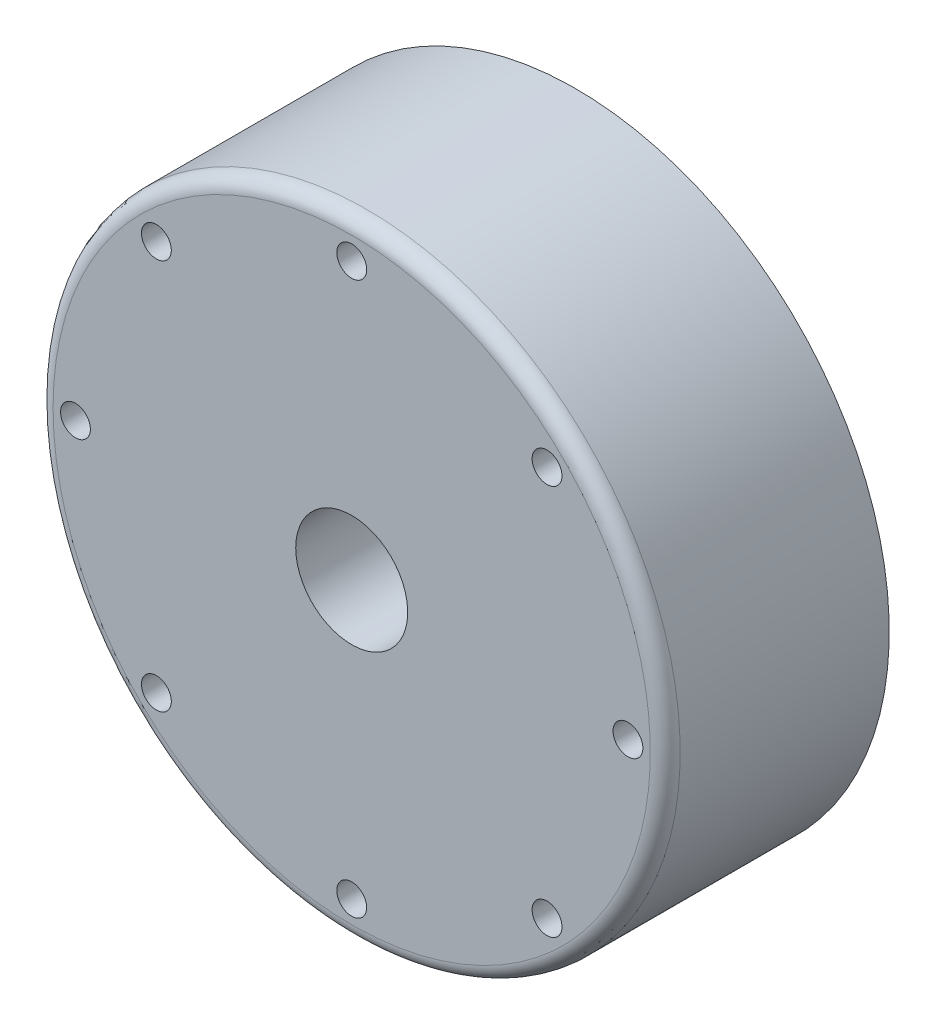
ISO-10303-21;
HEADER;
FILE_DESCRIPTION(('STEP AP214'),'2;1');
FILE_NAME('part.step','',(''),(''),'','','');
FILE_SCHEMA(('AUTOMOTIVE_DESIGN { 1 0 10303 214 1 1 1 1 }'));
ENDSEC;
DATA;
#1=APPLICATION_CONTEXT('core data for automotive mechanical design processes');
#2=APPLICATION_PROTOCOL_DEFINITION('international standard','automotive_design',2000,#1);
#3=PRODUCT_CONTEXT('',#1,'mechanical');
#4=PRODUCT('Part','Part','',(#3));
#5=PRODUCT_RELATED_PRODUCT_CATEGORY('part','',(#4));
#6=PRODUCT_DEFINITION_FORMATION('','',#4);
#7=PRODUCT_DEFINITION_CONTEXT('part definition',#1,'design');
#8=PRODUCT_DEFINITION('design','',#6,#7);
#9=PRODUCT_DEFINITION_SHAPE('','',#8);
#10=(LENGTH_UNIT() NAMED_UNIT(*) SI_UNIT(.MILLI.,.METRE.));
#11=(NAMED_UNIT(*) PLANE_ANGLE_UNIT() SI_UNIT($,.RADIAN.));
#12=(NAMED_UNIT(*) SI_UNIT($,.STERADIAN.) SOLID_ANGLE_UNIT());
#13=UNCERTAINTY_MEASURE_WITH_UNIT(LENGTH_MEASURE(1.E-05),#10,'distance_accuracy_value','');
#14=(GEOMETRIC_REPRESENTATION_CONTEXT(3) GLOBAL_UNCERTAINTY_ASSIGNED_CONTEXT((#13)) GLOBAL_UNIT_ASSIGNED_CONTEXT((#10,
#11,#12)) REPRESENTATION_CONTEXT('',''));
#15=CARTESIAN_POINT('',(0.,0.,0.));
#16=DIRECTION('',(0.,0.,1.));
#17=DIRECTION('',(1.,0.,0.));
#18=AXIS2_PLACEMENT_3D('',#15,#16,#17);
#19=CARTESIAN_POINT('',(0.,0.,0.));
#20=DIRECTION('',(0.,0.,1.));
#21=DIRECTION('',(1.,0.,0.));
#22=AXIS2_PLACEMENT_3D('',#19,#20,#21);
#23=PLANE('',#22);
#24=CARTESIAN_POINT('',(0.,0.,0.));
#25=DIRECTION('',(0.,0.,1.));
#26=DIRECTION('',(1.,0.,0.));
#27=AXIS2_PLACEMENT_3D('',#24,#25,#26);
#28=CIRCLE('',#27,7.5);
#29=CARTESIAN_POINT('',(-7.5,0.,0.));
#30=VERTEX_POINT('',#29);
#31=EDGE_CURVE('E93',#30,#30,#28,.T.);
#32=ORIENTED_EDGE('',*,*,#31,.T.);
#33=EDGE_LOOP('',(#32));
#34=FACE_BOUND('',#33,.T.);
#35=CARTESIAN_POINT('',(0.,0.,0.));
#36=DIRECTION('',(0.,0.,1.));
#37=DIRECTION('',(1.,0.,0.));
#38=AXIS2_PLACEMENT_3D('',#35,#36,#37);
#39=CIRCLE('',#38,42.);
#40=CARTESIAN_POINT('',(-42.,0.,0.));
#41=VERTEX_POINT('',#40);
#42=EDGE_CURVE('E11',#41,#41,#39,.T.);
#43=ORIENTED_EDGE('',*,*,#42,.F.);
#44=EDGE_LOOP('',(#43));
#45=FACE_BOUND('',#44,.T.);
#46=ADVANCED_FACE('F17',(#34,#45),#23,.F.);
#47=CARTESIAN_POINT('',(0.,0.,30.));
#48=DIRECTION('',(0.,0.,1.));
#49=DIRECTION('',(1.,0.,0.));
#50=AXIS2_PLACEMENT_3D('',#47,#48,#49);
#51=PLANE('',#50);
#52=CARTESIAN_POINT('',(0.,0.,30.));
#53=DIRECTION('',(0.,0.,-1.));
#54=DIRECTION('',(1.,0.,0.));
#55=AXIS2_PLACEMENT_3D('',#52,#53,#54);
#56=CIRCLE('',#55,7.5);
#57=CARTESIAN_POINT('',(-7.5,0.,30.));
#58=VERTEX_POINT('',#57);
#59=EDGE_CURVE('E123',#58,#58,#56,.T.);
#60=ORIENTED_EDGE('',*,*,#59,.T.);
#61=EDGE_LOOP('',(#60));
#62=FACE_BOUND('',#61,.T.);
#63=CARTESIAN_POINT('',(0.,37.,30.));
#64=DIRECTION('',(0.,0.,-1.));
#65=DIRECTION('',(1.,0.,0.));
#66=AXIS2_PLACEMENT_3D('',#63,#64,#65);
#67=CIRCLE('',#66,2.);
#68=CARTESIAN_POINT('',(-2.,37.,30.));
#69=VERTEX_POINT('',#68);
#70=EDGE_CURVE('E191',#69,#69,#67,.T.);
#71=ORIENTED_EDGE('',*,*,#70,.T.);
#72=EDGE_LOOP('',(#71));
#73=FACE_BOUND('',#72,.T.);
#74=CARTESIAN_POINT('',(0.,-37.,30.));
#75=DIRECTION('',(0.,0.,-1.));
#76=DIRECTION('',(1.,0.,0.));
#77=AXIS2_PLACEMENT_3D('',#74,#75,#76);
#78=CIRCLE('',#77,2.);
#79=CARTESIAN_POINT('',(-2.,-37.,30.));
#80=VERTEX_POINT('',#79);
#81=EDGE_CURVE('E117',#80,#80,#78,.T.);
#82=ORIENTED_EDGE('',*,*,#81,.T.);
#83=EDGE_LOOP('',(#82));
#84=FACE_BOUND('',#83,.T.);
#85=CARTESIAN_POINT('',(-26.1629509039023,26.1629509039023,30.));
#86=DIRECTION('',(0.,0.,-1.));
#87=DIRECTION('',(1.,0.,0.));
#88=AXIS2_PLACEMENT_3D('',#85,#86,#87);
#89=CIRCLE('',#88,2.);
#90=CARTESIAN_POINT('',(-28.1629509039023,26.1629509039023,30.));
#91=VERTEX_POINT('',#90);
#92=EDGE_CURVE('E171',#91,#91,#89,.T.);
#93=ORIENTED_EDGE('',*,*,#92,.T.);
#94=EDGE_LOOP('',(#93));
#95=FACE_BOUND('',#94,.T.);
#96=CARTESIAN_POINT('',(26.1629509039023,-26.1629509039023,30.));
#97=DIRECTION('',(0.,0.,-1.));
#98=DIRECTION('',(1.,0.,0.));
#99=AXIS2_PLACEMENT_3D('',#96,#97,#98);
#100=CIRCLE('',#99,2.);
#101=CARTESIAN_POINT('',(24.1629509039023,-26.1629509039023,30.));
#102=VERTEX_POINT('',#101);
#103=EDGE_CURVE('E125',#102,#102,#100,.T.);
#104=ORIENTED_EDGE('',*,*,#103,.T.);
#105=EDGE_LOOP('',(#104));
#106=FACE_BOUND('',#105,.T.);
#107=CARTESIAN_POINT('',(26.1629509039023,26.1629509039022,30.));
#108=DIRECTION('',(0.,0.,-1.));
#109=DIRECTION('',(1.,0.,0.));
#110=AXIS2_PLACEMENT_3D('',#107,#108,#109);
#111=CIRCLE('',#110,2.);
#112=CARTESIAN_POINT('',(24.1629509039023,26.1629509039022,30.));
#113=VERTEX_POINT('',#112);
#114=EDGE_CURVE('E190',#113,#113,#111,.T.);
#115=ORIENTED_EDGE('',*,*,#114,.T.);
#116=EDGE_LOOP('',(#115));
#117=FACE_BOUND('',#116,.T.);
#118=CARTESIAN_POINT('',(-26.1629509039023,-26.1629509039023,30.));
#119=DIRECTION('',(0.,0.,-1.));
#120=DIRECTION('',(1.,0.,0.));
#121=AXIS2_PLACEMENT_3D('',#118,#119,#120);
#122=CIRCLE('',#121,2.);
#123=CARTESIAN_POINT('',(-28.1629509039023,-26.1629509039023,30.));
#124=VERTEX_POINT('',#123);
#125=EDGE_CURVE('E165',#124,#124,#122,.T.);
#126=ORIENTED_EDGE('',*,*,#125,.T.);
#127=EDGE_LOOP('',(#126));
#128=FACE_BOUND('',#127,.T.);
#129=CARTESIAN_POINT('',(-37.,0.,30.));
#130=DIRECTION('',(0.,0.,-1.));
#131=DIRECTION('',(1.,0.,0.));
#132=AXIS2_PLACEMENT_3D('',#129,#130,#131);
#133=CIRCLE('',#132,2.);
#134=CARTESIAN_POINT('',(-39.,0.,30.));
#135=VERTEX_POINT('',#134);
#136=EDGE_CURVE('E131',#135,#135,#133,.T.);
#137=ORIENTED_EDGE('',*,*,#136,.T.);
#138=EDGE_LOOP('',(#137));
#139=FACE_BOUND('',#138,.T.);
#140=CARTESIAN_POINT('',(37.,0.,30.));
#141=DIRECTION('',(0.,0.,-1.));
#142=DIRECTION('',(1.,0.,0.));
#143=AXIS2_PLACEMENT_3D('',#140,#141,#142);
#144=CIRCLE('',#143,2.);
#145=CARTESIAN_POINT('',(35.,0.,30.));
#146=VERTEX_POINT('',#145);
#147=EDGE_CURVE('E161',#146,#146,#144,.T.);
#148=ORIENTED_EDGE('',*,*,#147,.T.);
#149=EDGE_LOOP('',(#148));
#150=FACE_BOUND('',#149,.T.);
#151=CARTESIAN_POINT('',(0.,0.,30.));
#152=DIRECTION('',(0.,0.,-1.));
#153=DIRECTION('',(-1.,0.,0.));
#154=AXIS2_PLACEMENT_3D('',#151,#152,#153);
#155=CIRCLE('',#154,40.);
#156=CARTESIAN_POINT('',(-40.,0.,30.));
#157=VERTEX_POINT('',#156);
#158=EDGE_CURVE('E104',#157,#157,#155,.T.);
#159=ORIENTED_EDGE('',*,*,#158,.F.);
#160=EDGE_LOOP('',(#159));
#161=FACE_BOUND('',#160,.T.);
#162=ADVANCED_FACE('F243',(#62,#73,#84,#95,#106,#117,#128,#139,#150,#161),#51,.T.);
#163=CARTESIAN_POINT('',(0.,0.,0.));
#164=DIRECTION('',(0.,0.,1.));
#165=DIRECTION('',(1.,0.,0.));
#166=AXIS2_PLACEMENT_3D('',#163,#164,#165);
#167=CYLINDRICAL_SURFACE('',#166,42.);
#168=CARTESIAN_POINT('',(0.,0.,28.));
#169=DIRECTION('',(0.,0.,1.));
#170=DIRECTION('',(-1.,0.,0.));
#171=AXIS2_PLACEMENT_3D('',#168,#169,#170);
#172=CIRCLE('',#171,42.);
#173=CARTESIAN_POINT('',(-42.,0.,28.));
#174=VERTEX_POINT('',#173);
#175=EDGE_CURVE('E106',#174,#174,#172,.T.);
#176=ORIENTED_EDGE('',*,*,#175,.F.);
#177=DIRECTION('',(0.,0.,-1.));
#178=VECTOR('',#177,1.);
#179=CARTESIAN_POINT('',(-42.,0.,0.));
#180=LINE('',#179,#178);
#181=EDGE_CURVE('E28',#174,#41,#180,.T.);
#182=ORIENTED_EDGE('',*,*,#181,.T.);
#183=ORIENTED_EDGE('',*,*,#42,.T.);
#184=ORIENTED_EDGE('',*,*,#181,.F.);
#185=EDGE_LOOP('',(#176,#182,#183,#184));
#186=FACE_BOUND('',#185,.T.);
#187=ADVANCED_FACE('F249',(#186),#167,.T.);
#188=CARTESIAN_POINT('',(0.,0.,28.));
#189=DIRECTION('',(0.,0.,1.));
#190=DIRECTION('',(1.,0.,0.));
#191=AXIS2_PLACEMENT_3D('',#188,#189,#190);
#192=TOROIDAL_SURFACE('',#191,40.,2.);
#193=ORIENTED_EDGE('',*,*,#158,.T.);
#194=CARTESIAN_POINT('',(-40.,0.,28.));
#195=DIRECTION('',(0.,-1.,0.));
#196=DIRECTION('',(-1.,0.,0.));
#197=AXIS2_PLACEMENT_3D('',#194,#195,#196);
#198=CIRCLE('',#197,2.);
#199=EDGE_CURVE('E101',#157,#174,#198,.T.);
#200=ORIENTED_EDGE('',*,*,#199,.T.);
#201=ORIENTED_EDGE('',*,*,#175,.T.);
#202=ORIENTED_EDGE('',*,*,#199,.F.);
#203=EDGE_LOOP('',(#193,#200,#201,#202));
#204=FACE_BOUND('',#203,.T.);
#205=ADVANCED_FACE('F102',(#204),#192,.T.);
#206=CARTESIAN_POINT('',(0.,0.,30.));
#207=DIRECTION('',(0.,0.,-1.));
#208=DIRECTION('',(1.,0.,0.));
#209=AXIS2_PLACEMENT_3D('',#206,#207,#208);
#210=CYLINDRICAL_SURFACE('',#209,7.5);
#211=ORIENTED_EDGE('',*,*,#59,.F.);
#212=DIRECTION('',(0.,0.,-1.));
#213=VECTOR('',#212,1.);
#214=CARTESIAN_POINT('',(-7.5,0.,30.));
#215=LINE('',#214,#213);
#216=EDGE_CURVE('E120',#58,#30,#215,.T.);
#217=ORIENTED_EDGE('',*,*,#216,.T.);
#218=ORIENTED_EDGE('',*,*,#31,.F.);
#219=ORIENTED_EDGE('',*,*,#216,.F.);
#220=EDGE_LOOP('',(#211,#217,#218,#219));
#221=FACE_BOUND('',#220,.T.);
#222=ADVANCED_FACE('F257',(#221),#210,.F.);
#223=CARTESIAN_POINT('',(0.,37.,20.));
#224=DIRECTION('',(0.,0.,1.));
#225=DIRECTION('',(1.,0.,0.));
#226=AXIS2_PLACEMENT_3D('',#223,#224,#225);
#227=PLANE('',#226);
#228=CARTESIAN_POINT('',(0.,37.,20.));
#229=DIRECTION('',(0.,0.,-1.));
#230=DIRECTION('',(1.,0.,0.));
#231=AXIS2_PLACEMENT_3D('',#228,#229,#230);
#232=CIRCLE('',#231,2.);
#233=CARTESIAN_POINT('',(-2.,37.,20.));
#234=VERTEX_POINT('',#233);
#235=EDGE_CURVE('E140',#234,#234,#232,.T.);
#236=ORIENTED_EDGE('',*,*,#235,.F.);
#237=EDGE_LOOP('',(#236));
#238=FACE_BOUND('',#237,.T.);
#239=ADVANCED_FACE('F315',(#238),#227,.T.);
#240=CARTESIAN_POINT('',(0.,37.,30.));
#241=DIRECTION('',(0.,0.,-1.));
#242=DIRECTION('',(1.,0.,0.));
#243=AXIS2_PLACEMENT_3D('',#240,#241,#242);
#244=CYLINDRICAL_SURFACE('',#243,2.);
#245=ORIENTED_EDGE('',*,*,#70,.F.);
#246=DIRECTION('',(0.,0.,-1.));
#247=VECTOR('',#246,1.);
#248=CARTESIAN_POINT('',(-2.,37.,30.));
#249=LINE('',#248,#247);
#250=EDGE_CURVE('E164',#69,#234,#249,.T.);
#251=ORIENTED_EDGE('',*,*,#250,.T.);
#252=ORIENTED_EDGE('',*,*,#235,.T.);
#253=ORIENTED_EDGE('',*,*,#250,.F.);
#254=EDGE_LOOP('',(#245,#251,#252,#253));
#255=FACE_BOUND('',#254,.T.);
#256=ADVANCED_FACE('F261',(#255),#244,.F.);
#257=CARTESIAN_POINT('',(0.,-37.,20.));
#258=DIRECTION('',(0.,0.,1.));
#259=DIRECTION('',(1.,0.,0.));
#260=AXIS2_PLACEMENT_3D('',#257,#258,#259);
#261=PLANE('',#260);
#262=CARTESIAN_POINT('',(0.,-37.,20.));
#263=DIRECTION('',(0.,0.,-1.));
#264=DIRECTION('',(1.,0.,0.));
#265=AXIS2_PLACEMENT_3D('',#262,#263,#264);
#266=CIRCLE('',#265,2.);
#267=CARTESIAN_POINT('',(-2.,-37.,20.));
#268=VERTEX_POINT('',#267);
#269=EDGE_CURVE('E156',#268,#268,#266,.T.);
#270=ORIENTED_EDGE('',*,*,#269,.F.);
#271=EDGE_LOOP('',(#270));
#272=FACE_BOUND('',#271,.T.);
#273=ADVANCED_FACE('F258',(#272),#261,.T.);
#274=CARTESIAN_POINT('',(0.,-37.,30.));
#275=DIRECTION('',(0.,0.,-1.));
#276=DIRECTION('',(1.,0.,0.));
#277=AXIS2_PLACEMENT_3D('',#274,#275,#276);
#278=CYLINDRICAL_SURFACE('',#277,2.);
#279=ORIENTED_EDGE('',*,*,#81,.F.);
#280=DIRECTION('',(0.,0.,-1.));
#281=VECTOR('',#280,1.);
#282=CARTESIAN_POINT('',(-2.,-37.,30.));
#283=LINE('',#282,#281);
#284=EDGE_CURVE('E152',#80,#268,#283,.T.);
#285=ORIENTED_EDGE('',*,*,#284,.T.);
#286=ORIENTED_EDGE('',*,*,#269,.T.);
#287=ORIENTED_EDGE('',*,*,#284,.F.);
#288=EDGE_LOOP('',(#279,#285,#286,#287));
#289=FACE_BOUND('',#288,.T.);
#290=ADVANCED_FACE('F260',(#289),#278,.F.);
#291=CARTESIAN_POINT('',(-26.1629509039023,26.1629509039023,20.));
#292=DIRECTION('',(0.,0.,1.));
#293=DIRECTION('',(1.,0.,0.));
#294=AXIS2_PLACEMENT_3D('',#291,#292,#293);
#295=PLANE('',#294);
#296=CARTESIAN_POINT('',(-26.1629509039023,26.1629509039023,20.));
#297=DIRECTION('',(0.,0.,-1.));
#298=DIRECTION('',(1.,0.,0.));
#299=AXIS2_PLACEMENT_3D('',#296,#297,#298);
#300=CIRCLE('',#299,2.);
#301=CARTESIAN_POINT('',(-28.1629509039023,26.1629509039023,20.));
#302=VERTEX_POINT('',#301);
#303=EDGE_CURVE('E145',#302,#302,#300,.T.);
#304=ORIENTED_EDGE('',*,*,#303,.F.);
#305=EDGE_LOOP('',(#304));
#306=FACE_BOUND('',#305,.T.);
#307=ADVANCED_FACE('F19',(#306),#295,.T.);
#308=CARTESIAN_POINT('',(-26.1629509039023,26.1629509039023,30.));
#309=DIRECTION('',(0.,0.,-1.));
#310=DIRECTION('',(1.,0.,0.));
#311=AXIS2_PLACEMENT_3D('',#308,#309,#310);
#312=CYLINDRICAL_SURFACE('',#311,2.);
#313=ORIENTED_EDGE('',*,*,#92,.F.);
#314=DIRECTION('',(0.,0.,-1.));
#315=VECTOR('',#314,1.);
#316=CARTESIAN_POINT('',(-28.1629509039023,26.1629509039023,30.));
#317=LINE('',#316,#315);
#318=EDGE_CURVE('E149',#91,#302,#317,.T.);
#319=ORIENTED_EDGE('',*,*,#318,.T.);
#320=ORIENTED_EDGE('',*,*,#303,.T.);
#321=ORIENTED_EDGE('',*,*,#318,.F.);
#322=EDGE_LOOP('',(#313,#319,#320,#321));
#323=FACE_BOUND('',#322,.T.);
#324=ADVANCED_FACE('F276',(#323),#312,.F.);
#325=CARTESIAN_POINT('',(26.1629509039023,-26.1629509039023,20.));
#326=DIRECTION('',(0.,0.,1.));
#327=DIRECTION('',(1.,0.,0.));
#328=AXIS2_PLACEMENT_3D('',#325,#326,#327);
#329=PLANE('',#328);
#330=CARTESIAN_POINT('',(26.1629509039023,-26.1629509039023,20.));
#331=DIRECTION('',(0.,0.,-1.));
#332=DIRECTION('',(1.,0.,0.));
#333=AXIS2_PLACEMENT_3D('',#330,#331,#332);
#334=CIRCLE('',#333,2.);
#335=CARTESIAN_POINT('',(24.1629509039023,-26.1629509039023,20.));
#336=VERTEX_POINT('',#335);
#337=EDGE_CURVE('E144',#336,#336,#334,.T.);
#338=ORIENTED_EDGE('',*,*,#337,.F.);
#339=EDGE_LOOP('',(#338));
#340=FACE_BOUND('',#339,.T.);
#341=ADVANCED_FACE('F266',(#340),#329,.T.);
#342=CARTESIAN_POINT('',(26.1629509039023,-26.1629509039023,30.));
#343=DIRECTION('',(0.,0.,-1.));
#344=DIRECTION('',(1.,0.,0.));
#345=AXIS2_PLACEMENT_3D('',#342,#343,#344);
#346=CYLINDRICAL_SURFACE('',#345,2.);
#347=ORIENTED_EDGE('',*,*,#103,.F.);
#348=DIRECTION('',(0.,0.,-1.));
#349=VECTOR('',#348,1.);
#350=CARTESIAN_POINT('',(24.1629509039023,-26.1629509039023,30.));
#351=LINE('',#350,#349);
#352=EDGE_CURVE('E129',#102,#336,#351,.T.);
#353=ORIENTED_EDGE('',*,*,#352,.T.);
#354=ORIENTED_EDGE('',*,*,#337,.T.);
#355=ORIENTED_EDGE('',*,*,#352,.F.);
#356=EDGE_LOOP('',(#347,#353,#354,#355));
#357=FACE_BOUND('',#356,.T.);
#358=ADVANCED_FACE('F263',(#357),#346,.F.);
#359=CARTESIAN_POINT('',(26.1629509039023,26.1629509039022,20.));
#360=DIRECTION('',(0.,0.,1.));
#361=DIRECTION('',(1.,0.,0.));
#362=AXIS2_PLACEMENT_3D('',#359,#360,#361);
#363=PLANE('',#362);
#364=CARTESIAN_POINT('',(26.1629509039023,26.1629509039022,20.));
#365=DIRECTION('',(0.,0.,-1.));
#366=DIRECTION('',(1.,0.,0.));
#367=AXIS2_PLACEMENT_3D('',#364,#365,#366);
#368=CIRCLE('',#367,2.);
#369=CARTESIAN_POINT('',(24.1629509039023,26.1629509039022,20.));
#370=VERTEX_POINT('',#369);
#371=EDGE_CURVE('E130',#370,#370,#368,.T.);
#372=ORIENTED_EDGE('',*,*,#371,.F.);
#373=EDGE_LOOP('',(#372));
#374=FACE_BOUND('',#373,.T.);
#375=ADVANCED_FACE('F265',(#374),#363,.T.);
#376=CARTESIAN_POINT('',(26.1629509039023,26.1629509039022,30.));
#377=DIRECTION('',(0.,0.,-1.));
#378=DIRECTION('',(1.,0.,0.));
#379=AXIS2_PLACEMENT_3D('',#376,#377,#378);
#380=CYLINDRICAL_SURFACE('',#379,2.);
#381=ORIENTED_EDGE('',*,*,#114,.F.);
#382=DIRECTION('',(0.,0.,-1.));
#383=VECTOR('',#382,1.);
#384=CARTESIAN_POINT('',(24.1629509039023,26.1629509039022,30.));
#385=LINE('',#384,#383);
#386=EDGE_CURVE('E201',#113,#370,#385,.T.);
#387=ORIENTED_EDGE('',*,*,#386,.T.);
#388=ORIENTED_EDGE('',*,*,#371,.T.);
#389=ORIENTED_EDGE('',*,*,#386,.F.);
#390=EDGE_LOOP('',(#381,#387,#388,#389));
#391=FACE_BOUND('',#390,.T.);
#392=ADVANCED_FACE('F273',(#391),#380,.F.);
#393=CARTESIAN_POINT('',(-26.1629509039023,-26.1629509039023,20.));
#394=DIRECTION('',(0.,0.,1.));
#395=DIRECTION('',(1.,0.,0.));
#396=AXIS2_PLACEMENT_3D('',#393,#394,#395);
#397=PLANE('',#396);
#398=CARTESIAN_POINT('',(-26.1629509039023,-26.1629509039023,20.));
#399=DIRECTION('',(0.,0.,-1.));
#400=DIRECTION('',(1.,0.,0.));
#401=AXIS2_PLACEMENT_3D('',#398,#399,#400);
#402=CIRCLE('',#401,2.);
#403=CARTESIAN_POINT('',(-28.1629509039023,-26.1629509039023,20.));
#404=VERTEX_POINT('',#403);
#405=EDGE_CURVE('E187',#404,#404,#402,.T.);
#406=ORIENTED_EDGE('',*,*,#405,.F.);
#407=EDGE_LOOP('',(#406));
#408=FACE_BOUND('',#407,.T.);
#409=ADVANCED_FACE('F237',(#408),#397,.T.);
#410=CARTESIAN_POINT('',(-26.1629509039023,-26.1629509039023,30.));
#411=DIRECTION('',(0.,0.,-1.));
#412=DIRECTION('',(1.,0.,0.));
#413=AXIS2_PLACEMENT_3D('',#410,#411,#412);
#414=CYLINDRICAL_SURFACE('',#413,2.);
#415=ORIENTED_EDGE('',*,*,#125,.F.);
#416=DIRECTION('',(0.,0.,-1.));
#417=VECTOR('',#416,1.);
#418=CARTESIAN_POINT('',(-28.1629509039023,-26.1629509039023,30.));
#419=LINE('',#418,#417);
#420=EDGE_CURVE('E168',#124,#404,#419,.T.);
#421=ORIENTED_EDGE('',*,*,#420,.T.);
#422=ORIENTED_EDGE('',*,*,#405,.T.);
#423=ORIENTED_EDGE('',*,*,#420,.F.);
#424=EDGE_LOOP('',(#415,#421,#422,#423));
#425=FACE_BOUND('',#424,.T.);
#426=ADVANCED_FACE('F227',(#425),#414,.F.);
#427=CARTESIAN_POINT('',(-37.,0.,20.));
#428=DIRECTION('',(0.,0.,1.));
#429=DIRECTION('',(1.,0.,0.));
#430=AXIS2_PLACEMENT_3D('',#427,#428,#429);
#431=PLANE('',#430);
#432=CARTESIAN_POINT('',(-37.,0.,20.));
#433=DIRECTION('',(0.,0.,-1.));
#434=DIRECTION('',(1.,0.,0.));
#435=AXIS2_PLACEMENT_3D('',#432,#433,#434);
#436=CIRCLE('',#435,2.);
#437=CARTESIAN_POINT('',(-39.,0.,20.));
#438=VERTEX_POINT('',#437);
#439=EDGE_CURVE('E21',#438,#438,#436,.T.);
#440=ORIENTED_EDGE('',*,*,#439,.F.);
#441=EDGE_LOOP('',(#440));
#442=FACE_BOUND('',#441,.T.);
#443=ADVANCED_FACE('F225',(#442),#431,.T.);
#444=CARTESIAN_POINT('',(-37.,0.,30.));
#445=DIRECTION('',(0.,0.,-1.));
#446=DIRECTION('',(1.,0.,0.));
#447=AXIS2_PLACEMENT_3D('',#444,#445,#446);
#448=CYLINDRICAL_SURFACE('',#447,2.);
#449=ORIENTED_EDGE('',*,*,#136,.F.);
#450=DIRECTION('',(0.,0.,-1.));
#451=VECTOR('',#450,1.);
#452=CARTESIAN_POINT('',(-39.,0.,30.));
#453=LINE('',#452,#451);
#454=EDGE_CURVE('E134',#135,#438,#453,.T.);
#455=ORIENTED_EDGE('',*,*,#454,.T.);
#456=ORIENTED_EDGE('',*,*,#439,.T.);
#457=ORIENTED_EDGE('',*,*,#454,.F.);
#458=EDGE_LOOP('',(#449,#455,#456,#457));
#459=FACE_BOUND('',#458,.T.);
#460=ADVANCED_FACE('F221',(#459),#448,.F.);
#461=CARTESIAN_POINT('',(37.,0.,20.));
#462=DIRECTION('',(0.,0.,1.));
#463=DIRECTION('',(1.,0.,0.));
#464=AXIS2_PLACEMENT_3D('',#461,#462,#463);
#465=PLANE('',#464);
#466=CARTESIAN_POINT('',(37.,0.,20.));
#467=DIRECTION('',(0.,0.,-1.));
#468=DIRECTION('',(1.,0.,0.));
#469=AXIS2_PLACEMENT_3D('',#466,#467,#468);
#470=CIRCLE('',#469,2.);
#471=CARTESIAN_POINT('',(35.,0.,20.));
#472=VERTEX_POINT('',#471);
#473=EDGE_CURVE('E135',#472,#472,#470,.T.);
#474=ORIENTED_EDGE('',*,*,#473,.F.);
#475=EDGE_LOOP('',(#474));
#476=FACE_BOUND('',#475,.T.);
#477=ADVANCED_FACE('F235',(#476),#465,.T.);
#478=CARTESIAN_POINT('',(37.,0.,30.));
#479=DIRECTION('',(0.,0.,-1.));
#480=DIRECTION('',(1.,0.,0.));
#481=AXIS2_PLACEMENT_3D('',#478,#479,#480);
#482=CYLINDRICAL_SURFACE('',#481,2.);
#483=ORIENTED_EDGE('',*,*,#147,.F.);
#484=DIRECTION('',(0.,0.,-1.));
#485=VECTOR('',#484,1.);
#486=CARTESIAN_POINT('',(35.,0.,30.));
#487=LINE('',#486,#485);
#488=EDGE_CURVE('E157',#146,#472,#487,.T.);
#489=ORIENTED_EDGE('',*,*,#488,.T.);
#490=ORIENTED_EDGE('',*,*,#473,.T.);
#491=ORIENTED_EDGE('',*,*,#488,.F.);
#492=EDGE_LOOP('',(#483,#489,#490,#491));
#493=FACE_BOUND('',#492,.T.);
#494=ADVANCED_FACE('F303',(#493),#482,.F.);
#495=CLOSED_SHELL('',(#46,#162,#187,#205,#222,#239,#256,#273,#290,#307,#324,#341,#358,#375,#392,
#409,#426,#443,#460,#477,#494));
#496=MANIFOLD_SOLID_BREP('B1',#495);
#497=ADVANCED_BREP_SHAPE_REPRESENTATION('',(#18,#496),#14);
#498=SHAPE_DEFINITION_REPRESENTATION(#9,#497);
ENDSEC;
END-ISO-10303-21;
